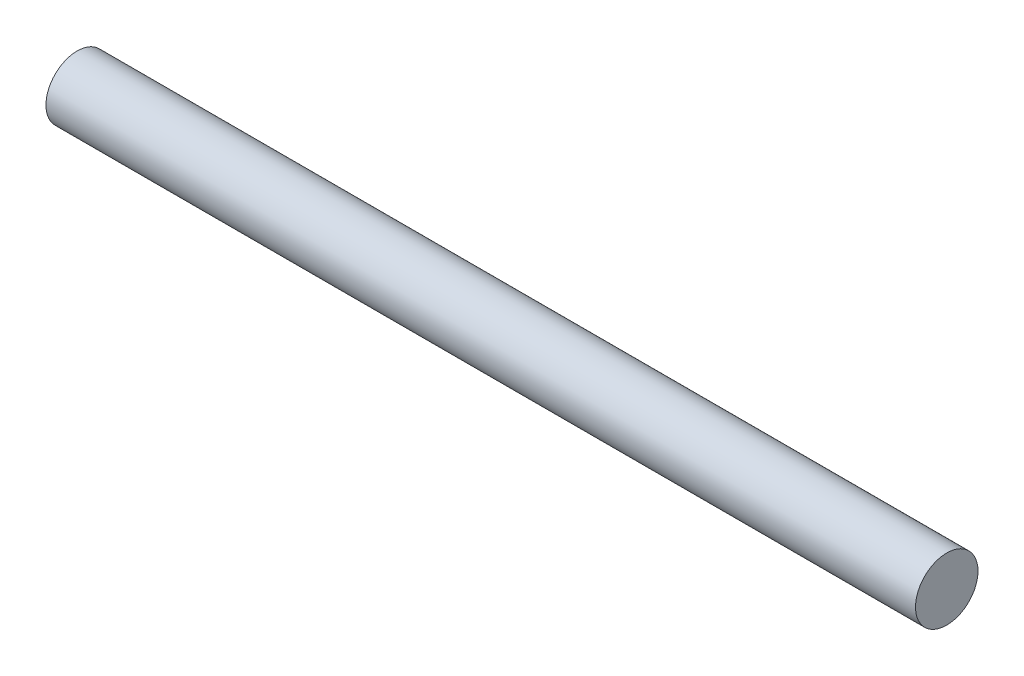
ISO-10303-21;
HEADER;
FILE_DESCRIPTION(('STEP AP214'),'2;1');
FILE_NAME('part.step','',(''),(''),'','','');
FILE_SCHEMA(('AUTOMOTIVE_DESIGN { 1 0 10303 214 1 1 1 1 }'));
ENDSEC;
DATA;
#1=APPLICATION_CONTEXT('core data for automotive mechanical design processes');
#2=APPLICATION_PROTOCOL_DEFINITION('international standard','automotive_design',2000,#1);
#3=PRODUCT_CONTEXT('',#1,'mechanical');
#4=PRODUCT('Part','Part','',(#3));
#5=PRODUCT_RELATED_PRODUCT_CATEGORY('part','',(#4));
#6=PRODUCT_DEFINITION_FORMATION('','',#4);
#7=PRODUCT_DEFINITION_CONTEXT('part definition',#1,'design');
#8=PRODUCT_DEFINITION('design','',#6,#7);
#9=PRODUCT_DEFINITION_SHAPE('','',#8);
#10=(LENGTH_UNIT() NAMED_UNIT(*) SI_UNIT(.MILLI.,.METRE.));
#11=(NAMED_UNIT(*) PLANE_ANGLE_UNIT() SI_UNIT($,.RADIAN.));
#12=(NAMED_UNIT(*) SI_UNIT($,.STERADIAN.) SOLID_ANGLE_UNIT());
#13=UNCERTAINTY_MEASURE_WITH_UNIT(LENGTH_MEASURE(1.E-05),#10,'distance_accuracy_value','');
#14=(GEOMETRIC_REPRESENTATION_CONTEXT(3) GLOBAL_UNCERTAINTY_ASSIGNED_CONTEXT((#13)) GLOBAL_UNIT_ASSIGNED_CONTEXT((#10,
#11,#12)) REPRESENTATION_CONTEXT('',''));
#15=CARTESIAN_POINT('',(0.,0.,0.));
#16=DIRECTION('',(0.,0.,1.));
#17=DIRECTION('',(1.,0.,0.));
#18=AXIS2_PLACEMENT_3D('',#15,#16,#17);
#19=CARTESIAN_POINT('',(41.73,0.,0.));
#20=DIRECTION('',(-1.,0.,0.));
#21=DIRECTION('',(0.,0.,1.));
#22=AXIS2_PLACEMENT_3D('',#19,#20,#21);
#23=CYLINDRICAL_SURFACE('',#22,1.5);
#24=CARTESIAN_POINT('',(41.73,0.,0.));
#25=DIRECTION('',(1.,0.,0.));
#26=DIRECTION('',(0.,0.,-1.));
#27=AXIS2_PLACEMENT_3D('',#24,#25,#26);
#28=CIRCLE('',#27,1.5);
#29=CARTESIAN_POINT('',(41.73,0.,-1.5));
#30=VERTEX_POINT('',#29);
#31=EDGE_CURVE('E10',#30,#30,#28,.T.);
#32=ORIENTED_EDGE('',*,*,#31,.F.);
#33=EDGE_LOOP('',(#32));
#34=FACE_BOUND('',#33,.T.);
#35=CARTESIAN_POINT('',(0.,0.,0.));
#36=DIRECTION('',(1.,0.,0.));
#37=DIRECTION('',(0.,0.,-1.));
#38=AXIS2_PLACEMENT_3D('',#35,#36,#37);
#39=CIRCLE('',#38,1.5);
#40=CARTESIAN_POINT('',(0.,0.,-1.5));
#41=VERTEX_POINT('',#40);
#42=EDGE_CURVE('E34',#41,#41,#39,.T.);
#43=ORIENTED_EDGE('',*,*,#42,.T.);
#44=EDGE_LOOP('',(#43));
#45=FACE_BOUND('',#44,.T.);
#46=ADVANCED_FACE('F31',(#34,#45),#23,.T.);
#47=CARTESIAN_POINT('',(41.73,0.,0.));
#48=DIRECTION('',(1.,0.,0.));
#49=DIRECTION('',(0.,0.,-1.));
#50=AXIS2_PLACEMENT_3D('',#47,#48,#49);
#51=PLANE('',#50);
#52=ORIENTED_EDGE('',*,*,#31,.T.);
#53=EDGE_LOOP('',(#52));
#54=FACE_BOUND('',#53,.T.);
#55=ADVANCED_FACE('F46',(#54),#51,.T.);
#56=CARTESIAN_POINT('',(0.,0.,0.));
#57=DIRECTION('',(1.,0.,0.));
#58=DIRECTION('',(0.,0.,-1.));
#59=AXIS2_PLACEMENT_3D('',#56,#57,#58);
#60=PLANE('',#59);
#61=ORIENTED_EDGE('',*,*,#42,.F.);
#62=EDGE_LOOP('',(#61));
#63=FACE_BOUND('',#62,.T.);
#64=ADVANCED_FACE('F44',(#63),#60,.F.);
#65=CLOSED_SHELL('',(#46,#55,#64));
#66=MANIFOLD_SOLID_BREP('B2',#65);
#67=ADVANCED_BREP_SHAPE_REPRESENTATION('',(#18,#66),#14);
#68=SHAPE_DEFINITION_REPRESENTATION(#9,#67);
ENDSEC;
END-ISO-10303-21;
